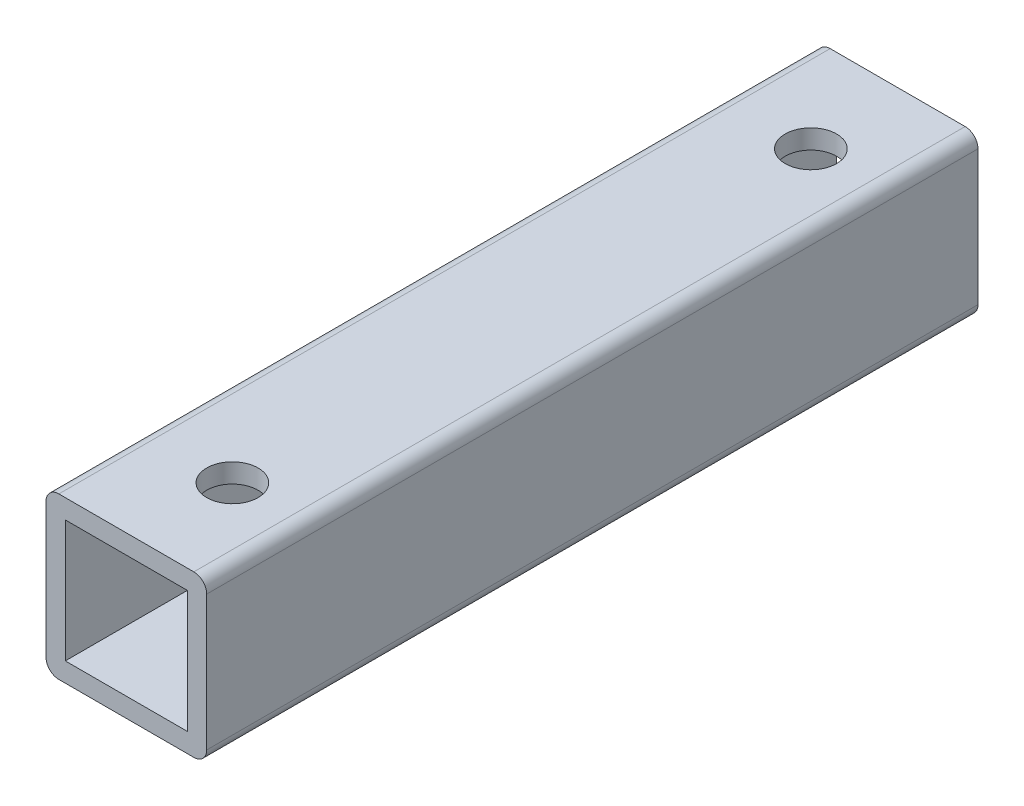
ISO-10303-21;
HEADER;
FILE_DESCRIPTION(('STEP AP214'),'2;1');
FILE_NAME('part.step','',(''),(''),'','','');
FILE_SCHEMA(('AUTOMOTIVE_DESIGN { 1 0 10303 214 1 1 1 1 }'));
ENDSEC;
DATA;
#1=APPLICATION_CONTEXT('core data for automotive mechanical design processes');
#2=APPLICATION_PROTOCOL_DEFINITION('international standard','automotive_design',2000,#1);
#3=PRODUCT_CONTEXT('',#1,'mechanical');
#4=PRODUCT('Part','Part','',(#3));
#5=PRODUCT_RELATED_PRODUCT_CATEGORY('part','',(#4));
#6=PRODUCT_DEFINITION_FORMATION('','',#4);
#7=PRODUCT_DEFINITION_CONTEXT('part definition',#1,'design');
#8=PRODUCT_DEFINITION('design','',#6,#7);
#9=PRODUCT_DEFINITION_SHAPE('','',#8);
#10=(LENGTH_UNIT() NAMED_UNIT(*) SI_UNIT(.MILLI.,.METRE.));
#11=(NAMED_UNIT(*) PLANE_ANGLE_UNIT() SI_UNIT($,.RADIAN.));
#12=(NAMED_UNIT(*) SI_UNIT($,.STERADIAN.) SOLID_ANGLE_UNIT());
#13=UNCERTAINTY_MEASURE_WITH_UNIT(LENGTH_MEASURE(1.E-05),#10,'distance_accuracy_value','');
#14=(GEOMETRIC_REPRESENTATION_CONTEXT(3) GLOBAL_UNCERTAINTY_ASSIGNED_CONTEXT((#13)) GLOBAL_UNIT_ASSIGNED_CONTEXT((#10,
#11,#12)) REPRESENTATION_CONTEXT('',''));
#15=CARTESIAN_POINT('',(0.,0.,0.));
#16=DIRECTION('',(0.,0.,1.));
#17=DIRECTION('',(1.,0.,0.));
#18=AXIS2_PLACEMENT_3D('',#15,#16,#17);
#19=CARTESIAN_POINT('',(12.5,-12.5,-60.));
#20=DIRECTION('',(1.,0.,0.));
#21=DIRECTION('',(0.,0.,-1.));
#22=AXIS2_PLACEMENT_3D('',#19,#20,#21);
#23=PLANE('',#22);
#24=DIRECTION('',(0.,1.,0.));
#25=VECTOR('',#24,1.);
#26=CARTESIAN_POINT('',(12.5,-12.5,60.));
#27=LINE('',#26,#25);
#28=CARTESIAN_POINT('',(12.5,-10.5,60.));
#29=VERTEX_POINT('',#28);
#30=CARTESIAN_POINT('',(12.5,10.5,60.));
#31=VERTEX_POINT('',#30);
#32=EDGE_CURVE('E206',#29,#31,#27,.T.);
#33=ORIENTED_EDGE('',*,*,#32,.F.);
#34=DIRECTION('',(0.,0.,1.));
#35=VECTOR('',#34,1.);
#36=CARTESIAN_POINT('',(12.5,-10.5,-60.));
#37=LINE('',#36,#35);
#38=CARTESIAN_POINT('',(12.5,-10.5,-60.));
#39=VERTEX_POINT('',#38);
#40=EDGE_CURVE('E269',#29,#39,#37,.F.);
#41=ORIENTED_EDGE('',*,*,#40,.T.);
#42=DIRECTION('',(0.,1.,0.));
#43=VECTOR('',#42,1.);
#44=CARTESIAN_POINT('',(12.5,-12.5,-60.));
#45=LINE('',#44,#43);
#46=CARTESIAN_POINT('',(12.5,10.5,-60.));
#47=VERTEX_POINT('',#46);
#48=EDGE_CURVE('E227',#39,#47,#45,.T.);
#49=ORIENTED_EDGE('',*,*,#48,.T.);
#50=DIRECTION('',(0.,0.,1.));
#51=VECTOR('',#50,1.);
#52=CARTESIAN_POINT('',(12.5,10.5,-60.));
#53=LINE('',#52,#51);
#54=EDGE_CURVE('E266',#47,#31,#53,.T.);
#55=ORIENTED_EDGE('',*,*,#54,.T.);
#56=EDGE_LOOP('',(#33,#41,#49,#55));
#57=FACE_BOUND('',#56,.T.);
#58=ADVANCED_FACE('F81',(#57),#23,.T.);
#59=CARTESIAN_POINT('',(-12.5,-12.5,-60.));
#60=DIRECTION('',(0.,-1.,0.));
#61=DIRECTION('',(0.,0.,-1.));
#62=AXIS2_PLACEMENT_3D('',#59,#60,#61);
#63=PLANE('',#62);
#64=CARTESIAN_POINT('',(1.5,-12.5,45.));
#65=DIRECTION('',(0.,1.,0.));
#66=DIRECTION('',(0.,0.,1.));
#67=AXIS2_PLACEMENT_3D('',#64,#65,#66);
#68=CIRCLE('',#67,4.);
#69=CARTESIAN_POINT('',(1.5,-12.5,49.));
#70=VERTEX_POINT('',#69);
#71=EDGE_CURVE('E274',#70,#70,#68,.T.);
#72=ORIENTED_EDGE('',*,*,#71,.T.);
#73=EDGE_LOOP('',(#72));
#74=FACE_BOUND('',#73,.T.);
#75=CARTESIAN_POINT('',(1.5,-12.5,-45.));
#76=DIRECTION('',(0.,1.,0.));
#77=DIRECTION('',(0.,0.,1.));
#78=AXIS2_PLACEMENT_3D('',#75,#76,#77);
#79=CIRCLE('',#78,4.00000000000001);
#80=CARTESIAN_POINT('',(1.5,-12.5,-41.));
#81=VERTEX_POINT('',#80);
#82=EDGE_CURVE('E285',#81,#81,#79,.T.);
#83=ORIENTED_EDGE('',*,*,#82,.T.);
#84=EDGE_LOOP('',(#83));
#85=FACE_BOUND('',#84,.T.);
#86=DIRECTION('',(1.,0.,0.));
#87=VECTOR('',#86,1.);
#88=CARTESIAN_POINT('',(-12.5,-12.5,60.));
#89=LINE('',#88,#87);
#90=CARTESIAN_POINT('',(-10.5,-12.5,60.));
#91=VERTEX_POINT('',#90);
#92=CARTESIAN_POINT('',(10.5,-12.5,60.));
#93=VERTEX_POINT('',#92);
#94=EDGE_CURVE('E215',#91,#93,#89,.T.);
#95=ORIENTED_EDGE('',*,*,#94,.F.);
#96=DIRECTION('',(0.,0.,1.));
#97=VECTOR('',#96,1.);
#98=CARTESIAN_POINT('',(-10.5,-12.5,-60.));
#99=LINE('',#98,#97);
#100=CARTESIAN_POINT('',(-10.5,-12.5,-60.));
#101=VERTEX_POINT('',#100);
#102=EDGE_CURVE('E257',#91,#101,#99,.F.);
#103=ORIENTED_EDGE('',*,*,#102,.T.);
#104=DIRECTION('',(1.,0.,0.));
#105=VECTOR('',#104,1.);
#106=CARTESIAN_POINT('',(-12.5,-12.5,-60.));
#107=LINE('',#106,#105);
#108=CARTESIAN_POINT('',(10.5,-12.5,-60.));
#109=VERTEX_POINT('',#108);
#110=EDGE_CURVE('E238',#101,#109,#107,.T.);
#111=ORIENTED_EDGE('',*,*,#110,.T.);
#112=DIRECTION('',(0.,0.,1.));
#113=VECTOR('',#112,1.);
#114=CARTESIAN_POINT('',(10.5,-12.5,-60.));
#115=LINE('',#114,#113);
#116=EDGE_CURVE('E254',#109,#93,#115,.T.);
#117=ORIENTED_EDGE('',*,*,#116,.T.);
#118=EDGE_LOOP('',(#95,#103,#111,#117));
#119=FACE_BOUND('',#118,.T.);
#120=ADVANCED_FACE('F316',(#74,#85,#119),#63,.T.);
#121=CARTESIAN_POINT('',(-12.5,-12.5,-60.));
#122=DIRECTION('',(-1.,0.,0.));
#123=DIRECTION('',(0.,0.,1.));
#124=AXIS2_PLACEMENT_3D('',#121,#122,#123);
#125=PLANE('',#124);
#126=DIRECTION('',(0.,-1.,0.));
#127=VECTOR('',#126,1.);
#128=CARTESIAN_POINT('',(-12.5,-12.5,-60.));
#129=LINE('',#128,#127);
#130=CARTESIAN_POINT('',(-12.5,10.5,-60.));
#131=VERTEX_POINT('',#130);
#132=CARTESIAN_POINT('',(-12.5,-10.5,-60.));
#133=VERTEX_POINT('',#132);
#134=EDGE_CURVE('E235',#131,#133,#129,.T.);
#135=ORIENTED_EDGE('',*,*,#134,.T.);
#136=DIRECTION('',(0.,0.,1.));
#137=VECTOR('',#136,1.);
#138=CARTESIAN_POINT('',(-12.5,-10.5,-60.));
#139=LINE('',#138,#137);
#140=CARTESIAN_POINT('',(-12.5,-10.5,60.));
#141=VERTEX_POINT('',#140);
#142=EDGE_CURVE('E243',#133,#141,#139,.T.);
#143=ORIENTED_EDGE('',*,*,#142,.T.);
#144=DIRECTION('',(0.,-1.,0.));
#145=VECTOR('',#144,1.);
#146=CARTESIAN_POINT('',(-12.5,-12.5,60.));
#147=LINE('',#146,#145);
#148=CARTESIAN_POINT('',(-12.5,10.5,60.));
#149=VERTEX_POINT('',#148);
#150=EDGE_CURVE('E212',#149,#141,#147,.T.);
#151=ORIENTED_EDGE('',*,*,#150,.F.);
#152=DIRECTION('',(0.,0.,1.));
#153=VECTOR('',#152,1.);
#154=CARTESIAN_POINT('',(-12.5,10.5,-60.));
#155=LINE('',#154,#153);
#156=EDGE_CURVE('E241',#149,#131,#155,.F.);
#157=ORIENTED_EDGE('',*,*,#156,.T.);
#158=EDGE_LOOP('',(#135,#143,#151,#157));
#159=FACE_BOUND('',#158,.T.);
#160=ADVANCED_FACE('F322',(#159),#125,.T.);
#161=CARTESIAN_POINT('',(-12.5,12.5,-60.));
#162=DIRECTION('',(0.,1.,0.));
#163=DIRECTION('',(0.,0.,1.));
#164=AXIS2_PLACEMENT_3D('',#161,#162,#163);
#165=PLANE('',#164);
#166=CARTESIAN_POINT('',(1.5,12.5,45.));
#167=DIRECTION('',(0.,1.,0.));
#168=DIRECTION('',(0.,0.,1.));
#169=AXIS2_PLACEMENT_3D('',#166,#167,#168);
#170=CIRCLE('',#169,4.);
#171=CARTESIAN_POINT('',(1.5,12.5,49.));
#172=VERTEX_POINT('',#171);
#173=EDGE_CURVE('E280',#172,#172,#170,.T.);
#174=ORIENTED_EDGE('',*,*,#173,.F.);
#175=EDGE_LOOP('',(#174));
#176=FACE_BOUND('',#175,.T.);
#177=CARTESIAN_POINT('',(1.5,12.5,-45.));
#178=DIRECTION('',(0.,1.,0.));
#179=DIRECTION('',(0.,0.,1.));
#180=AXIS2_PLACEMENT_3D('',#177,#178,#179);
#181=CIRCLE('',#180,4.00000000000001);
#182=CARTESIAN_POINT('',(1.5,12.5,-41.));
#183=VERTEX_POINT('',#182);
#184=EDGE_CURVE('E290',#183,#183,#181,.T.);
#185=ORIENTED_EDGE('',*,*,#184,.F.);
#186=EDGE_LOOP('',(#185));
#187=FACE_BOUND('',#186,.T.);
#188=DIRECTION('',(-1.,0.,0.));
#189=VECTOR('',#188,1.);
#190=CARTESIAN_POINT('',(-12.5,12.5,-60.));
#191=LINE('',#190,#189);
#192=CARTESIAN_POINT('',(10.5,12.5,-60.));
#193=VERTEX_POINT('',#192);
#194=CARTESIAN_POINT('',(-10.5,12.5,-60.));
#195=VERTEX_POINT('',#194);
#196=EDGE_CURVE('E233',#193,#195,#191,.T.);
#197=ORIENTED_EDGE('',*,*,#196,.T.);
#198=DIRECTION('',(0.,0.,1.));
#199=VECTOR('',#198,1.);
#200=CARTESIAN_POINT('',(-10.5,12.5,-60.));
#201=LINE('',#200,#199);
#202=CARTESIAN_POINT('',(-10.5,12.5,60.));
#203=VERTEX_POINT('',#202);
#204=EDGE_CURVE('E12',#195,#203,#201,.T.);
#205=ORIENTED_EDGE('',*,*,#204,.T.);
#206=DIRECTION('',(-1.,0.,0.));
#207=VECTOR('',#206,1.);
#208=CARTESIAN_POINT('',(-12.5,12.5,60.));
#209=LINE('',#208,#207);
#210=CARTESIAN_POINT('',(10.5,12.5,60.));
#211=VERTEX_POINT('',#210);
#212=EDGE_CURVE('E209',#211,#203,#209,.T.);
#213=ORIENTED_EDGE('',*,*,#212,.F.);
#214=DIRECTION('',(0.,0.,1.));
#215=VECTOR('',#214,1.);
#216=CARTESIAN_POINT('',(10.5,12.5,-60.));
#217=LINE('',#216,#215);
#218=EDGE_CURVE('E90',#211,#193,#217,.F.);
#219=ORIENTED_EDGE('',*,*,#218,.T.);
#220=EDGE_LOOP('',(#197,#205,#213,#219));
#221=FACE_BOUND('',#220,.T.);
#222=ADVANCED_FACE('F327',(#176,#187,#221),#165,.T.);
#223=CARTESIAN_POINT('',(0.,0.,-60.));
#224=DIRECTION('',(0.,0.,1.));
#225=DIRECTION('',(1.,0.,0.));
#226=AXIS2_PLACEMENT_3D('',#223,#224,#225);
#227=PLANE('',#226);
#228=DIRECTION('',(1.,0.,0.));
#229=VECTOR('',#228,1.);
#230=CARTESIAN_POINT('',(0.,-9.5,-60.));
#231=LINE('',#230,#229);
#232=CARTESIAN_POINT('',(-9.5,-9.5,-60.));
#233=VERTEX_POINT('',#232);
#234=CARTESIAN_POINT('',(9.5,-9.5,-60.));
#235=VERTEX_POINT('',#234);
#236=EDGE_CURVE('E186',#233,#235,#231,.T.);
#237=ORIENTED_EDGE('',*,*,#236,.T.);
#238=DIRECTION('',(0.,1.,0.));
#239=VECTOR('',#238,1.);
#240=CARTESIAN_POINT('',(9.5,0.,-60.));
#241=LINE('',#240,#239);
#242=CARTESIAN_POINT('',(9.5,9.5,-60.));
#243=VERTEX_POINT('',#242);
#244=EDGE_CURVE('E218',#235,#243,#241,.T.);
#245=ORIENTED_EDGE('',*,*,#244,.T.);
#246=DIRECTION('',(-1.,0.,0.));
#247=VECTOR('',#246,1.);
#248=CARTESIAN_POINT('',(0.,9.5,-60.));
#249=LINE('',#248,#247);
#250=CARTESIAN_POINT('',(-9.5,9.5,-60.));
#251=VERTEX_POINT('',#250);
#252=EDGE_CURVE('E181',#243,#251,#249,.T.);
#253=ORIENTED_EDGE('',*,*,#252,.T.);
#254=DIRECTION('',(0.,-1.,0.));
#255=VECTOR('',#254,1.);
#256=CARTESIAN_POINT('',(-9.5,0.,-60.));
#257=LINE('',#256,#255);
#258=EDGE_CURVE('E221',#251,#233,#257,.T.);
#259=ORIENTED_EDGE('',*,*,#258,.T.);
#260=EDGE_LOOP('',(#237,#245,#253,#259));
#261=FACE_BOUND('',#260,.T.);
#262=ORIENTED_EDGE('',*,*,#110,.F.);
#263=CARTESIAN_POINT('',(-10.5,-10.5,-60.));
#264=DIRECTION('',(0.,0.,1.));
#265=DIRECTION('',(1.,0.,0.));
#266=AXIS2_PLACEMENT_3D('',#263,#264,#265);
#267=CIRCLE('',#266,2.);
#268=EDGE_CURVE('E264',#101,#133,#267,.F.);
#269=ORIENTED_EDGE('',*,*,#268,.T.);
#270=ORIENTED_EDGE('',*,*,#134,.F.);
#271=CARTESIAN_POINT('',(-10.5,10.5,-60.));
#272=DIRECTION('',(0.,0.,1.));
#273=DIRECTION('',(1.,0.,0.));
#274=AXIS2_PLACEMENT_3D('',#271,#272,#273);
#275=CIRCLE('',#274,2.);
#276=EDGE_CURVE('E98',#131,#195,#275,.F.);
#277=ORIENTED_EDGE('',*,*,#276,.T.);
#278=ORIENTED_EDGE('',*,*,#196,.F.);
#279=CARTESIAN_POINT('',(10.5,10.5,-60.));
#280=DIRECTION('',(0.,0.,1.));
#281=DIRECTION('',(1.,0.,0.));
#282=AXIS2_PLACEMENT_3D('',#279,#280,#281);
#283=CIRCLE('',#282,2.);
#284=EDGE_CURVE('E259',#193,#47,#283,.F.);
#285=ORIENTED_EDGE('',*,*,#284,.T.);
#286=ORIENTED_EDGE('',*,*,#48,.F.);
#287=CARTESIAN_POINT('',(10.5,-10.5,-60.));
#288=DIRECTION('',(0.,0.,1.));
#289=DIRECTION('',(1.,0.,0.));
#290=AXIS2_PLACEMENT_3D('',#287,#288,#289);
#291=CIRCLE('',#290,2.);
#292=EDGE_CURVE('E262',#39,#109,#291,.F.);
#293=ORIENTED_EDGE('',*,*,#292,.T.);
#294=EDGE_LOOP('',(#262,#269,#270,#277,#278,#285,#286,#293));
#295=FACE_BOUND('',#294,.T.);
#296=ADVANCED_FACE('F353',(#261,#295),#227,.F.);
#297=CARTESIAN_POINT('',(9.5,0.,-60.));
#298=DIRECTION('',(1.,0.,0.));
#299=DIRECTION('',(0.,0.,-1.));
#300=AXIS2_PLACEMENT_3D('',#297,#298,#299);
#301=PLANE('',#300);
#302=DIRECTION('',(0.,0.,1.));
#303=VECTOR('',#302,1.);
#304=CARTESIAN_POINT('',(9.5,-9.5,-60.));
#305=LINE('',#304,#303);
#306=CARTESIAN_POINT('',(9.5,-9.5,60.));
#307=VERTEX_POINT('',#306);
#308=EDGE_CURVE('E191',#235,#307,#305,.T.);
#309=ORIENTED_EDGE('',*,*,#308,.T.);
#310=DIRECTION('',(0.,1.,0.));
#311=VECTOR('',#310,1.);
#312=CARTESIAN_POINT('',(9.5,0.,60.));
#313=LINE('',#312,#311);
#314=CARTESIAN_POINT('',(9.5,9.5,60.));
#315=VERTEX_POINT('',#314);
#316=EDGE_CURVE('E189',#307,#315,#313,.T.);
#317=ORIENTED_EDGE('',*,*,#316,.T.);
#318=DIRECTION('',(0.,0.,1.));
#319=VECTOR('',#318,1.);
#320=CARTESIAN_POINT('',(9.5,9.5,-60.));
#321=LINE('',#320,#319);
#322=EDGE_CURVE('E173',#243,#315,#321,.T.);
#323=ORIENTED_EDGE('',*,*,#322,.F.);
#324=ORIENTED_EDGE('',*,*,#244,.F.);
#325=EDGE_LOOP('',(#309,#317,#323,#324));
#326=FACE_BOUND('',#325,.T.);
#327=ADVANCED_FACE('F190',(#326),#301,.F.);
#328=CARTESIAN_POINT('',(0.,-9.5,-60.));
#329=DIRECTION('',(0.,-1.,0.));
#330=DIRECTION('',(0.,0.,-1.));
#331=AXIS2_PLACEMENT_3D('',#328,#329,#330);
#332=PLANE('',#331);
#333=CARTESIAN_POINT('',(1.5,-9.5,45.));
#334=DIRECTION('',(0.,-1.,0.));
#335=DIRECTION('',(0.,0.,-1.));
#336=AXIS2_PLACEMENT_3D('',#333,#334,#335);
#337=CIRCLE('',#336,4.);
#338=CARTESIAN_POINT('',(1.5,-9.5,41.));
#339=VERTEX_POINT('',#338);
#340=EDGE_CURVE('E195',#339,#339,#337,.T.);
#341=ORIENTED_EDGE('',*,*,#340,.T.);
#342=EDGE_LOOP('',(#341));
#343=FACE_BOUND('',#342,.T.);
#344=CARTESIAN_POINT('',(1.5,-9.5,-45.));
#345=DIRECTION('',(0.,-1.,0.));
#346=DIRECTION('',(0.,0.,-1.));
#347=AXIS2_PLACEMENT_3D('',#344,#345,#346);
#348=CIRCLE('',#347,4.00000000000001);
#349=CARTESIAN_POINT('',(1.5,-9.5,-49.));
#350=VERTEX_POINT('',#349);
#351=EDGE_CURVE('E273',#350,#350,#348,.T.);
#352=ORIENTED_EDGE('',*,*,#351,.T.);
#353=EDGE_LOOP('',(#352));
#354=FACE_BOUND('',#353,.T.);
#355=DIRECTION('',(0.,0.,1.));
#356=VECTOR('',#355,1.);
#357=CARTESIAN_POINT('',(-9.5,-9.5,-60.));
#358=LINE('',#357,#356);
#359=CARTESIAN_POINT('',(-9.5,-9.5,60.));
#360=VERTEX_POINT('',#359);
#361=EDGE_CURVE('E228',#233,#360,#358,.T.);
#362=ORIENTED_EDGE('',*,*,#361,.T.);
#363=DIRECTION('',(1.,0.,0.));
#364=VECTOR('',#363,1.);
#365=CARTESIAN_POINT('',(0.,-9.5,60.));
#366=LINE('',#365,#364);
#367=EDGE_CURVE('E201',#360,#307,#366,.T.);
#368=ORIENTED_EDGE('',*,*,#367,.T.);
#369=ORIENTED_EDGE('',*,*,#308,.F.);
#370=ORIENTED_EDGE('',*,*,#236,.F.);
#371=EDGE_LOOP('',(#362,#368,#369,#370));
#372=FACE_BOUND('',#371,.T.);
#373=ADVANCED_FACE('F372',(#343,#354,#372),#332,.F.);
#374=CARTESIAN_POINT('',(-9.5,0.,-60.));
#375=DIRECTION('',(-1.,0.,0.));
#376=DIRECTION('',(0.,0.,1.));
#377=AXIS2_PLACEMENT_3D('',#374,#375,#376);
#378=PLANE('',#377);
#379=DIRECTION('',(0.,0.,1.));
#380=VECTOR('',#379,1.);
#381=CARTESIAN_POINT('',(-9.5,9.5,-60.));
#382=LINE('',#381,#380);
#383=CARTESIAN_POINT('',(-9.5,9.5,60.));
#384=VERTEX_POINT('',#383);
#385=EDGE_CURVE('E185',#251,#384,#382,.T.);
#386=ORIENTED_EDGE('',*,*,#385,.T.);
#387=DIRECTION('',(0.,-1.,0.));
#388=VECTOR('',#387,1.);
#389=CARTESIAN_POINT('',(-9.5,0.,60.));
#390=LINE('',#389,#388);
#391=EDGE_CURVE('E199',#384,#360,#390,.T.);
#392=ORIENTED_EDGE('',*,*,#391,.T.);
#393=ORIENTED_EDGE('',*,*,#361,.F.);
#394=ORIENTED_EDGE('',*,*,#258,.F.);
#395=EDGE_LOOP('',(#386,#392,#393,#394));
#396=FACE_BOUND('',#395,.T.);
#397=ADVANCED_FACE('F375',(#396),#378,.F.);
#398=CARTESIAN_POINT('',(0.,9.5,-60.));
#399=DIRECTION('',(0.,1.,0.));
#400=DIRECTION('',(0.,0.,1.));
#401=AXIS2_PLACEMENT_3D('',#398,#399,#400);
#402=PLANE('',#401);
#403=CARTESIAN_POINT('',(1.5,9.5,45.));
#404=DIRECTION('',(0.,1.,0.));
#405=DIRECTION('',(0.,0.,1.));
#406=AXIS2_PLACEMENT_3D('',#403,#404,#405);
#407=CIRCLE('',#406,4.);
#408=CARTESIAN_POINT('',(1.5,9.5,49.));
#409=VERTEX_POINT('',#408);
#410=EDGE_CURVE('E85',#409,#409,#407,.T.);
#411=ORIENTED_EDGE('',*,*,#410,.T.);
#412=EDGE_LOOP('',(#411));
#413=FACE_BOUND('',#412,.T.);
#414=CARTESIAN_POINT('',(1.5,9.5,-45.));
#415=DIRECTION('',(0.,1.,0.));
#416=DIRECTION('',(0.,0.,1.));
#417=AXIS2_PLACEMENT_3D('',#414,#415,#416);
#418=CIRCLE('',#417,4.00000000000001);
#419=CARTESIAN_POINT('',(1.5,9.5,-41.));
#420=VERTEX_POINT('',#419);
#421=EDGE_CURVE('E271',#420,#420,#418,.T.);
#422=ORIENTED_EDGE('',*,*,#421,.T.);
#423=EDGE_LOOP('',(#422));
#424=FACE_BOUND('',#423,.T.);
#425=ORIENTED_EDGE('',*,*,#322,.T.);
#426=DIRECTION('',(-1.,0.,0.));
#427=VECTOR('',#426,1.);
#428=CARTESIAN_POINT('',(0.,9.5,60.));
#429=LINE('',#428,#427);
#430=EDGE_CURVE('E178',#315,#384,#429,.T.);
#431=ORIENTED_EDGE('',*,*,#430,.T.);
#432=ORIENTED_EDGE('',*,*,#385,.F.);
#433=ORIENTED_EDGE('',*,*,#252,.F.);
#434=EDGE_LOOP('',(#425,#431,#432,#433));
#435=FACE_BOUND('',#434,.T.);
#436=ADVANCED_FACE('F175',(#413,#424,#435),#402,.F.);
#437=CARTESIAN_POINT('',(0.,0.,60.));
#438=DIRECTION('',(0.,0.,1.));
#439=DIRECTION('',(1.,0.,0.));
#440=AXIS2_PLACEMENT_3D('',#437,#438,#439);
#441=PLANE('',#440);
#442=ORIENTED_EDGE('',*,*,#150,.T.);
#443=CARTESIAN_POINT('',(-10.5,-10.5,60.));
#444=DIRECTION('',(0.,0.,1.));
#445=DIRECTION('',(1.,0.,0.));
#446=AXIS2_PLACEMENT_3D('',#443,#444,#445);
#447=CIRCLE('',#446,2.);
#448=EDGE_CURVE('E252',#141,#91,#447,.T.);
#449=ORIENTED_EDGE('',*,*,#448,.T.);
#450=ORIENTED_EDGE('',*,*,#94,.T.);
#451=CARTESIAN_POINT('',(10.5,-10.5,60.));
#452=DIRECTION('',(0.,0.,1.));
#453=DIRECTION('',(1.,0.,0.));
#454=AXIS2_PLACEMENT_3D('',#451,#452,#453);
#455=CIRCLE('',#454,2.);
#456=EDGE_CURVE('E250',#93,#29,#455,.T.);
#457=ORIENTED_EDGE('',*,*,#456,.T.);
#458=ORIENTED_EDGE('',*,*,#32,.T.);
#459=CARTESIAN_POINT('',(10.5,10.5,60.));
#460=DIRECTION('',(0.,0.,1.));
#461=DIRECTION('',(1.,0.,0.));
#462=AXIS2_PLACEMENT_3D('',#459,#460,#461);
#463=CIRCLE('',#462,2.);
#464=EDGE_CURVE('E246',#31,#211,#463,.T.);
#465=ORIENTED_EDGE('',*,*,#464,.T.);
#466=ORIENTED_EDGE('',*,*,#212,.T.);
#467=CARTESIAN_POINT('',(-10.5,10.5,60.));
#468=DIRECTION('',(0.,0.,1.));
#469=DIRECTION('',(1.,0.,0.));
#470=AXIS2_PLACEMENT_3D('',#467,#468,#469);
#471=CIRCLE('',#470,2.);
#472=EDGE_CURVE('E248',#203,#149,#471,.T.);
#473=ORIENTED_EDGE('',*,*,#472,.T.);
#474=EDGE_LOOP('',(#442,#449,#450,#457,#458,#465,#466,#473));
#475=FACE_BOUND('',#474,.T.);
#476=ORIENTED_EDGE('',*,*,#430,.F.);
#477=ORIENTED_EDGE('',*,*,#316,.F.);
#478=ORIENTED_EDGE('',*,*,#367,.F.);
#479=ORIENTED_EDGE('',*,*,#391,.F.);
#480=EDGE_LOOP('',(#476,#477,#478,#479));
#481=FACE_BOUND('',#480,.T.);
#482=ADVANCED_FACE('F197',(#475,#481),#441,.T.);
#483=CARTESIAN_POINT('',(-10.5,-10.5,-60.));
#484=DIRECTION('',(0.,0.,1.));
#485=DIRECTION('',(1.,0.,0.));
#486=AXIS2_PLACEMENT_3D('',#483,#484,#485);
#487=CYLINDRICAL_SURFACE('',#486,2.);
#488=ORIENTED_EDGE('',*,*,#268,.F.);
#489=ORIENTED_EDGE('',*,*,#102,.F.);
#490=ORIENTED_EDGE('',*,*,#448,.F.);
#491=ORIENTED_EDGE('',*,*,#142,.F.);
#492=EDGE_LOOP('',(#488,#489,#490,#491));
#493=FACE_BOUND('',#492,.T.);
#494=ADVANCED_FACE('F329',(#493),#487,.T.);
#495=CARTESIAN_POINT('',(10.5,-10.5,-60.));
#496=DIRECTION('',(0.,0.,1.));
#497=DIRECTION('',(1.,0.,0.));
#498=AXIS2_PLACEMENT_3D('',#495,#496,#497);
#499=CYLINDRICAL_SURFACE('',#498,2.);
#500=ORIENTED_EDGE('',*,*,#292,.F.);
#501=ORIENTED_EDGE('',*,*,#40,.F.);
#502=ORIENTED_EDGE('',*,*,#456,.F.);
#503=ORIENTED_EDGE('',*,*,#116,.F.);
#504=EDGE_LOOP('',(#500,#501,#502,#503));
#505=FACE_BOUND('',#504,.T.);
#506=ADVANCED_FACE('F332',(#505),#499,.T.);
#507=CARTESIAN_POINT('',(-10.5,10.5,-60.));
#508=DIRECTION('',(0.,0.,1.));
#509=DIRECTION('',(1.,0.,0.));
#510=AXIS2_PLACEMENT_3D('',#507,#508,#509);
#511=CYLINDRICAL_SURFACE('',#510,2.);
#512=ORIENTED_EDGE('',*,*,#276,.F.);
#513=ORIENTED_EDGE('',*,*,#156,.F.);
#514=ORIENTED_EDGE('',*,*,#472,.F.);
#515=ORIENTED_EDGE('',*,*,#204,.F.);
#516=EDGE_LOOP('',(#512,#513,#514,#515));
#517=FACE_BOUND('',#516,.T.);
#518=ADVANCED_FACE('F335',(#517),#511,.T.);
#519=CARTESIAN_POINT('',(10.5,10.5,-60.));
#520=DIRECTION('',(0.,0.,1.));
#521=DIRECTION('',(1.,0.,0.));
#522=AXIS2_PLACEMENT_3D('',#519,#520,#521);
#523=CYLINDRICAL_SURFACE('',#522,2.);
#524=ORIENTED_EDGE('',*,*,#284,.F.);
#525=ORIENTED_EDGE('',*,*,#218,.F.);
#526=ORIENTED_EDGE('',*,*,#464,.F.);
#527=ORIENTED_EDGE('',*,*,#54,.F.);
#528=EDGE_LOOP('',(#524,#525,#526,#527));
#529=FACE_BOUND('',#528,.T.);
#530=ADVANCED_FACE('F83',(#529),#523,.T.);
#531=CARTESIAN_POINT('',(1.5,-12.5,-45.));
#532=DIRECTION('',(0.,1.,0.));
#533=DIRECTION('',(0.,0.,1.));
#534=AXIS2_PLACEMENT_3D('',#531,#532,#533);
#535=CYLINDRICAL_SURFACE('',#534,4.00000000000001);
#536=ORIENTED_EDGE('',*,*,#184,.T.);
#537=EDGE_LOOP('',(#536));
#538=FACE_BOUND('',#537,.T.);
#539=ORIENTED_EDGE('',*,*,#421,.F.);
#540=EDGE_LOOP('',(#539));
#541=FACE_BOUND('',#540,.T.);
#542=ADVANCED_FACE('F302',(#538,#541),#535,.F.);
#543=CARTESIAN_POINT('',(1.5,-12.5,45.));
#544=DIRECTION('',(0.,1.,0.));
#545=DIRECTION('',(0.,0.,1.));
#546=AXIS2_PLACEMENT_3D('',#543,#544,#545);
#547=CYLINDRICAL_SURFACE('',#546,4.);
#548=ORIENTED_EDGE('',*,*,#173,.T.);
#549=EDGE_LOOP('',(#548));
#550=FACE_BOUND('',#549,.T.);
#551=ORIENTED_EDGE('',*,*,#410,.F.);
#552=EDGE_LOOP('',(#551));
#553=FACE_BOUND('',#552,.T.);
#554=ADVANCED_FACE('F299',(#550,#553),#547,.F.);
#555=ORIENTED_EDGE('',*,*,#82,.F.);
#556=EDGE_LOOP('',(#555));
#557=FACE_BOUND('',#556,.T.);
#558=ORIENTED_EDGE('',*,*,#351,.F.);
#559=EDGE_LOOP('',(#558));
#560=FACE_BOUND('',#559,.T.);
#561=ADVANCED_FACE('F301',(#557,#560),#535,.F.);
#562=ORIENTED_EDGE('',*,*,#71,.F.);
#563=EDGE_LOOP('',(#562));
#564=FACE_BOUND('',#563,.T.);
#565=ORIENTED_EDGE('',*,*,#340,.F.);
#566=EDGE_LOOP('',(#565));
#567=FACE_BOUND('',#566,.T.);
#568=ADVANCED_FACE('F305',(#564,#567),#547,.F.);
#569=CLOSED_SHELL('',(#58,#120,#160,#222,#296,#327,#373,#397,#436,#482,#494,#506,#518,#530,#542,
#554,#561,#568));
#570=MANIFOLD_SOLID_BREP('B2',#569);
#571=ADVANCED_BREP_SHAPE_REPRESENTATION('',(#18,#570),#14);
#572=SHAPE_DEFINITION_REPRESENTATION(#9,#571);
ENDSEC;
END-ISO-10303-21;
